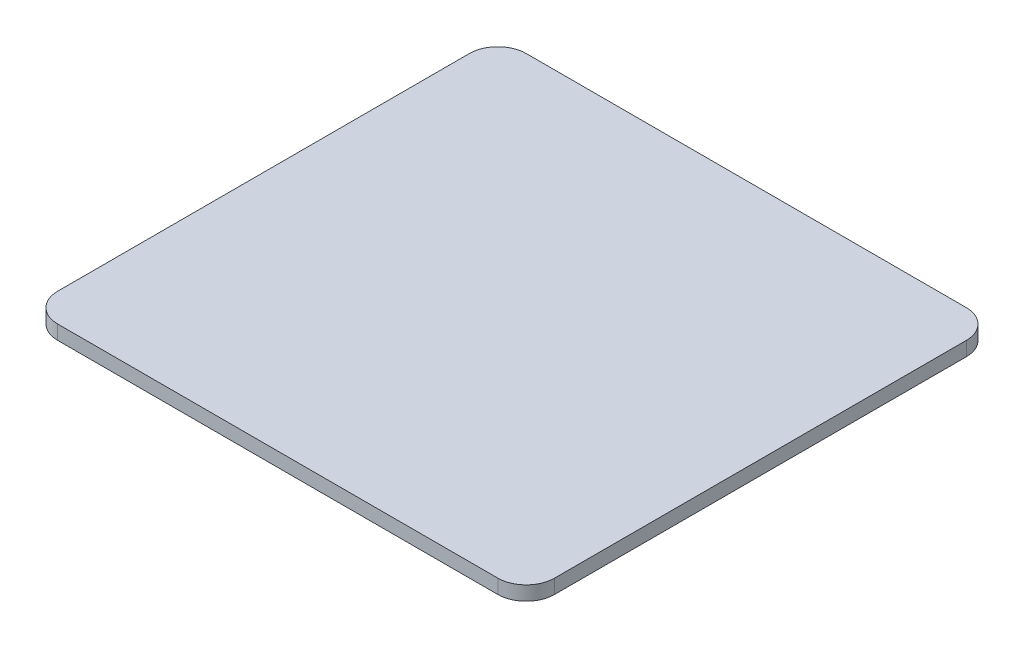
ISO-10303-21;
HEADER;
FILE_DESCRIPTION(('STEP AP214'),'2;1');
FILE_NAME('part.step','',(''),(''),'','','');
FILE_SCHEMA(('AUTOMOTIVE_DESIGN { 1 0 10303 214 1 1 1 1 }'));
ENDSEC;
DATA;
#1=APPLICATION_CONTEXT('core data for automotive mechanical design processes');
#2=APPLICATION_PROTOCOL_DEFINITION('international standard','automotive_design',2000,#1);
#3=PRODUCT_CONTEXT('',#1,'mechanical');
#4=PRODUCT('Part','Part','',(#3));
#5=PRODUCT_RELATED_PRODUCT_CATEGORY('part','',(#4));
#6=PRODUCT_DEFINITION_FORMATION('','',#4);
#7=PRODUCT_DEFINITION_CONTEXT('part definition',#1,'design');
#8=PRODUCT_DEFINITION('design','',#6,#7);
#9=PRODUCT_DEFINITION_SHAPE('','',#8);
#10=(LENGTH_UNIT() NAMED_UNIT(*) SI_UNIT(.MILLI.,.METRE.));
#11=(NAMED_UNIT(*) PLANE_ANGLE_UNIT() SI_UNIT($,.RADIAN.));
#12=(NAMED_UNIT(*) SI_UNIT($,.STERADIAN.) SOLID_ANGLE_UNIT());
#13=UNCERTAINTY_MEASURE_WITH_UNIT(LENGTH_MEASURE(1.E-05),#10,'distance_accuracy_value','');
#14=(GEOMETRIC_REPRESENTATION_CONTEXT(3) GLOBAL_UNCERTAINTY_ASSIGNED_CONTEXT((#13)) GLOBAL_UNIT_ASSIGNED_CONTEXT((#10,
#11,#12)) REPRESENTATION_CONTEXT('',''));
#15=CARTESIAN_POINT('',(0.,0.,0.));
#16=DIRECTION('',(0.,0.,1.));
#17=DIRECTION('',(1.,0.,0.));
#18=AXIS2_PLACEMENT_3D('',#15,#16,#17);
#19=CARTESIAN_POINT('',(129.3870044641,5.,-127.664689841221));
#20=DIRECTION('',(0.,-1.,0.));
#21=DIRECTION('',(0.,0.,-1.));
#22=AXIS2_PLACEMENT_3D('',#19,#20,#21);
#23=CYLINDRICAL_SURFACE('',#22,10.);
#24=CARTESIAN_POINT('',(129.3870044641,0.,-127.664689841221));
#25=DIRECTION('',(0.,1.,0.));
#26=DIRECTION('',(0.,0.,-1.));
#27=AXIS2_PLACEMENT_3D('',#24,#25,#26);
#28=CIRCLE('',#27,10.);
#29=CARTESIAN_POINT('',(139.387004464101,0.,-127.664689841221));
#30=VERTEX_POINT('',#29);
#31=CARTESIAN_POINT('',(129.3870044641,0.,-137.664689841221));
#32=VERTEX_POINT('',#31);
#33=EDGE_CURVE('E129',#30,#32,#28,.T.);
#34=ORIENTED_EDGE('',*,*,#33,.T.);
#35=DIRECTION('',(0.,-1.,0.));
#36=VECTOR('',#35,1.);
#37=CARTESIAN_POINT('',(129.3870044641,5.,-137.664689841221));
#38=LINE('',#37,#36);
#39=CARTESIAN_POINT('',(129.3870044641,5.,-137.664689841221));
#40=VERTEX_POINT('',#39);
#41=EDGE_CURVE('E11',#40,#32,#38,.T.);
#42=ORIENTED_EDGE('',*,*,#41,.F.);
#43=CARTESIAN_POINT('',(129.3870044641,5.,-127.664689841221));
#44=DIRECTION('',(0.,1.,0.));
#45=DIRECTION('',(0.,0.,-1.));
#46=AXIS2_PLACEMENT_3D('',#43,#44,#45);
#47=CIRCLE('',#46,10.);
#48=CARTESIAN_POINT('',(139.387004464101,5.,-127.664689841221));
#49=VERTEX_POINT('',#48);
#50=EDGE_CURVE('E143',#49,#40,#47,.T.);
#51=ORIENTED_EDGE('',*,*,#50,.F.);
#52=DIRECTION('',(0.,-1.,0.));
#53=VECTOR('',#52,1.);
#54=CARTESIAN_POINT('',(139.387004464101,5.,-127.664689841221));
#55=LINE('',#54,#53);
#56=EDGE_CURVE('E125',#49,#30,#55,.T.);
#57=ORIENTED_EDGE('',*,*,#56,.T.);
#58=EDGE_LOOP('',(#34,#42,#51,#57));
#59=FACE_BOUND('',#58,.T.);
#60=ADVANCED_FACE('F33',(#59),#23,.T.);
#61=CARTESIAN_POINT('',(-25.6129955358994,5.,-137.664689841221));
#62=DIRECTION('',(0.,0.,1.));
#63=DIRECTION('',(1.,0.,0.));
#64=AXIS2_PLACEMENT_3D('',#61,#62,#63);
#65=PLANE('',#64);
#66=DIRECTION('',(-1.,0.,0.));
#67=VECTOR('',#66,1.);
#68=CARTESIAN_POINT('',(-25.6129955358994,0.,-137.664689841221));
#69=LINE('',#68,#67);
#70=CARTESIAN_POINT('',(-25.6129955358994,0.,-137.664689841221));
#71=VERTEX_POINT('',#70);
#72=EDGE_CURVE('E132',#32,#71,#69,.T.);
#73=ORIENTED_EDGE('',*,*,#72,.T.);
#74=DIRECTION('',(0.,-1.,0.));
#75=VECTOR('',#74,1.);
#76=CARTESIAN_POINT('',(-25.6129955358994,5.,-137.664689841221));
#77=LINE('',#76,#75);
#78=CARTESIAN_POINT('',(-25.6129955358994,5.,-137.664689841221));
#79=VERTEX_POINT('',#78);
#80=EDGE_CURVE('E41',#79,#71,#77,.T.);
#81=ORIENTED_EDGE('',*,*,#80,.F.);
#82=DIRECTION('',(-1.,0.,0.));
#83=VECTOR('',#82,1.);
#84=CARTESIAN_POINT('',(-25.6129955358994,5.,-137.664689841221));
#85=LINE('',#84,#83);
#86=EDGE_CURVE('E92',#40,#79,#85,.T.);
#87=ORIENTED_EDGE('',*,*,#86,.F.);
#88=ORIENTED_EDGE('',*,*,#41,.T.);
#89=EDGE_LOOP('',(#73,#81,#87,#88));
#90=FACE_BOUND('',#89,.T.);
#91=ADVANCED_FACE('F178',(#90),#65,.F.);
#92=CARTESIAN_POINT('',(-25.6129955358995,5.,-127.664689841221));
#93=DIRECTION('',(0.,-1.,0.));
#94=DIRECTION('',(0.,0.,-1.));
#95=AXIS2_PLACEMENT_3D('',#92,#93,#94);
#96=CYLINDRICAL_SURFACE('',#95,10.);
#97=CARTESIAN_POINT('',(-25.6129955358995,0.,-127.664689841221));
#98=DIRECTION('',(0.,1.,0.));
#99=DIRECTION('',(0.,0.,1.));
#100=AXIS2_PLACEMENT_3D('',#97,#98,#99);
#101=CIRCLE('',#100,10.);
#102=CARTESIAN_POINT('',(-35.6129955358995,0.,-127.664689841221));
#103=VERTEX_POINT('',#102);
#104=EDGE_CURVE('E134',#71,#103,#101,.T.);
#105=ORIENTED_EDGE('',*,*,#104,.T.);
#106=DIRECTION('',(0.,-1.,0.));
#107=VECTOR('',#106,1.);
#108=CARTESIAN_POINT('',(-35.6129955358995,5.,-127.664689841221));
#109=LINE('',#108,#107);
#110=CARTESIAN_POINT('',(-35.6129955358995,5.,-127.664689841221));
#111=VERTEX_POINT('',#110);
#112=EDGE_CURVE('E150',#111,#103,#109,.T.);
#113=ORIENTED_EDGE('',*,*,#112,.F.);
#114=CARTESIAN_POINT('',(-25.6129955358995,5.,-127.664689841221));
#115=DIRECTION('',(0.,1.,0.));
#116=DIRECTION('',(0.,0.,1.));
#117=AXIS2_PLACEMENT_3D('',#114,#115,#116);
#118=CIRCLE('',#117,10.);
#119=EDGE_CURVE('E158',#79,#111,#118,.T.);
#120=ORIENTED_EDGE('',*,*,#119,.F.);
#121=ORIENTED_EDGE('',*,*,#80,.T.);
#122=EDGE_LOOP('',(#105,#113,#120,#121));
#123=FACE_BOUND('',#122,.T.);
#124=ADVANCED_FACE('F156',(#123),#96,.T.);
#125=CARTESIAN_POINT('',(-35.6129955358995,5.,-127.664689841221));
#126=DIRECTION('',(1.,0.,0.));
#127=DIRECTION('',(0.,0.,-1.));
#128=AXIS2_PLACEMENT_3D('',#125,#126,#127);
#129=PLANE('',#128);
#130=DIRECTION('',(0.,0.,1.));
#131=VECTOR('',#130,1.);
#132=CARTESIAN_POINT('',(-35.6129955358995,0.,-127.664689841221));
#133=LINE('',#132,#131);
#134=CARTESIAN_POINT('',(-35.6129955358995,0.,17.3353101587794));
#135=VERTEX_POINT('',#134);
#136=EDGE_CURVE('E136',#103,#135,#133,.T.);
#137=ORIENTED_EDGE('',*,*,#136,.T.);
#138=DIRECTION('',(0.,-1.,0.));
#139=VECTOR('',#138,1.);
#140=CARTESIAN_POINT('',(-35.6129955358995,5.,17.3353101587794));
#141=LINE('',#140,#139);
#142=CARTESIAN_POINT('',(-35.6129955358995,5.,17.3353101587794));
#143=VERTEX_POINT('',#142);
#144=EDGE_CURVE('E147',#143,#135,#141,.T.);
#145=ORIENTED_EDGE('',*,*,#144,.F.);
#146=DIRECTION('',(0.,0.,1.));
#147=VECTOR('',#146,1.);
#148=CARTESIAN_POINT('',(-35.6129955358995,5.,-127.664689841221));
#149=LINE('',#148,#147);
#150=EDGE_CURVE('E170',#111,#143,#149,.T.);
#151=ORIENTED_EDGE('',*,*,#150,.F.);
#152=ORIENTED_EDGE('',*,*,#112,.T.);
#153=EDGE_LOOP('',(#137,#145,#151,#152));
#154=FACE_BOUND('',#153,.T.);
#155=ADVANCED_FACE('F166',(#154),#129,.F.);
#156=CARTESIAN_POINT('',(-25.6129955358995,5.,17.3353101587794));
#157=DIRECTION('',(0.,-1.,0.));
#158=DIRECTION('',(0.,0.,-1.));
#159=AXIS2_PLACEMENT_3D('',#156,#157,#158);
#160=CYLINDRICAL_SURFACE('',#159,10.);
#161=CARTESIAN_POINT('',(-25.6129955358995,0.,17.3353101587794));
#162=DIRECTION('',(0.,1.,0.));
#163=DIRECTION('',(0.,0.,1.));
#164=AXIS2_PLACEMENT_3D('',#161,#162,#163);
#165=CIRCLE('',#164,10.);
#166=CARTESIAN_POINT('',(-25.6129955358995,0.,27.3353101587794));
#167=VERTEX_POINT('',#166);
#168=EDGE_CURVE('E138',#135,#167,#165,.T.);
#169=ORIENTED_EDGE('',*,*,#168,.T.);
#170=DIRECTION('',(0.,-1.,0.));
#171=VECTOR('',#170,1.);
#172=CARTESIAN_POINT('',(-25.6129955358995,5.,27.3353101587794));
#173=LINE('',#172,#171);
#174=CARTESIAN_POINT('',(-25.6129955358995,5.,27.3353101587794));
#175=VERTEX_POINT('',#174);
#176=EDGE_CURVE('E120',#175,#167,#173,.T.);
#177=ORIENTED_EDGE('',*,*,#176,.F.);
#178=CARTESIAN_POINT('',(-25.6129955358995,5.,17.3353101587794));
#179=DIRECTION('',(0.,1.,0.));
#180=DIRECTION('',(0.,0.,1.));
#181=AXIS2_PLACEMENT_3D('',#178,#179,#180);
#182=CIRCLE('',#181,10.);
#183=EDGE_CURVE('E111',#143,#175,#182,.T.);
#184=ORIENTED_EDGE('',*,*,#183,.F.);
#185=ORIENTED_EDGE('',*,*,#144,.T.);
#186=EDGE_LOOP('',(#169,#177,#184,#185));
#187=FACE_BOUND('',#186,.T.);
#188=ADVANCED_FACE('F169',(#187),#160,.T.);
#189=CARTESIAN_POINT('',(-25.6129955358994,5.,27.3353101587794));
#190=DIRECTION('',(0.,0.,-1.));
#191=DIRECTION('',(-1.,0.,0.));
#192=AXIS2_PLACEMENT_3D('',#189,#190,#191);
#193=PLANE('',#192);
#194=DIRECTION('',(1.,0.,0.));
#195=VECTOR('',#194,1.);
#196=CARTESIAN_POINT('',(-25.6129955358994,0.,27.3353101587794));
#197=LINE('',#196,#195);
#198=CARTESIAN_POINT('',(129.3870044641,0.,27.3353101587794));
#199=VERTEX_POINT('',#198);
#200=EDGE_CURVE('E119',#167,#199,#197,.T.);
#201=ORIENTED_EDGE('',*,*,#200,.T.);
#202=DIRECTION('',(0.,-1.,0.));
#203=VECTOR('',#202,1.);
#204=CARTESIAN_POINT('',(129.3870044641,5.,27.3353101587794));
#205=LINE('',#204,#203);
#206=CARTESIAN_POINT('',(129.3870044641,5.,27.3353101587794));
#207=VERTEX_POINT('',#206);
#208=EDGE_CURVE('E116',#207,#199,#205,.T.);
#209=ORIENTED_EDGE('',*,*,#208,.F.);
#210=DIRECTION('',(1.,0.,0.));
#211=VECTOR('',#210,1.);
#212=CARTESIAN_POINT('',(-25.6129955358994,5.,27.3353101587794));
#213=LINE('',#212,#211);
#214=EDGE_CURVE('E105',#175,#207,#213,.T.);
#215=ORIENTED_EDGE('',*,*,#214,.F.);
#216=ORIENTED_EDGE('',*,*,#176,.T.);
#217=EDGE_LOOP('',(#201,#209,#215,#216));
#218=FACE_BOUND('',#217,.T.);
#219=ADVANCED_FACE('F117',(#218),#193,.F.);
#220=CARTESIAN_POINT('',(129.387004464101,5.,17.3353101587794));
#221=DIRECTION('',(0.,-1.,0.));
#222=DIRECTION('',(0.,0.,-1.));
#223=AXIS2_PLACEMENT_3D('',#220,#221,#222);
#224=CYLINDRICAL_SURFACE('',#223,10.);
#225=CARTESIAN_POINT('',(129.387004464101,0.,17.3353101587794));
#226=DIRECTION('',(0.,1.,0.));
#227=DIRECTION('',(0.,0.,1.));
#228=AXIS2_PLACEMENT_3D('',#225,#226,#227);
#229=CIRCLE('',#228,10.);
#230=CARTESIAN_POINT('',(139.387004464101,0.,17.3353101587794));
#231=VERTEX_POINT('',#230);
#232=EDGE_CURVE('E78',#199,#231,#229,.T.);
#233=ORIENTED_EDGE('',*,*,#232,.T.);
#234=DIRECTION('',(0.,-1.,0.));
#235=VECTOR('',#234,1.);
#236=CARTESIAN_POINT('',(139.387004464101,5.,17.3353101587794));
#237=LINE('',#236,#235);
#238=CARTESIAN_POINT('',(139.387004464101,5.,17.3353101587794));
#239=VERTEX_POINT('',#238);
#240=EDGE_CURVE('E121',#239,#231,#237,.T.);
#241=ORIENTED_EDGE('',*,*,#240,.F.);
#242=CARTESIAN_POINT('',(129.387004464101,5.,17.3353101587794));
#243=DIRECTION('',(0.,1.,0.));
#244=DIRECTION('',(0.,0.,1.));
#245=AXIS2_PLACEMENT_3D('',#242,#243,#244);
#246=CIRCLE('',#245,10.);
#247=EDGE_CURVE('E109',#207,#239,#246,.T.);
#248=ORIENTED_EDGE('',*,*,#247,.F.);
#249=ORIENTED_EDGE('',*,*,#208,.T.);
#250=EDGE_LOOP('',(#233,#241,#248,#249));
#251=FACE_BOUND('',#250,.T.);
#252=ADVANCED_FACE('F123',(#251),#224,.T.);
#253=CARTESIAN_POINT('',(139.387004464101,5.,-127.664689841221));
#254=DIRECTION('',(-1.,0.,0.));
#255=DIRECTION('',(0.,0.,1.));
#256=AXIS2_PLACEMENT_3D('',#253,#254,#255);
#257=PLANE('',#256);
#258=DIRECTION('',(0.,0.,-1.));
#259=VECTOR('',#258,1.);
#260=CARTESIAN_POINT('',(139.387004464101,0.,-127.664689841221));
#261=LINE('',#260,#259);
#262=EDGE_CURVE('E84',#231,#30,#261,.T.);
#263=ORIENTED_EDGE('',*,*,#262,.T.);
#264=ORIENTED_EDGE('',*,*,#56,.F.);
#265=DIRECTION('',(0.,0.,-1.));
#266=VECTOR('',#265,1.);
#267=CARTESIAN_POINT('',(139.387004464101,5.,-127.664689841221));
#268=LINE('',#267,#266);
#269=EDGE_CURVE('E49',#239,#49,#268,.T.);
#270=ORIENTED_EDGE('',*,*,#269,.F.);
#271=ORIENTED_EDGE('',*,*,#240,.T.);
#272=EDGE_LOOP('',(#263,#264,#270,#271));
#273=FACE_BOUND('',#272,.T.);
#274=ADVANCED_FACE('F194',(#273),#257,.F.);
#275=CARTESIAN_POINT('',(129.3870044641,5.,-127.664689841221));
#276=DIRECTION('',(0.,-1.,0.));
#277=DIRECTION('',(0.,0.,-1.));
#278=AXIS2_PLACEMENT_3D('',#275,#276,#277);
#279=PLANE('',#278);
#280=ORIENTED_EDGE('',*,*,#50,.T.);
#281=ORIENTED_EDGE('',*,*,#86,.T.);
#282=ORIENTED_EDGE('',*,*,#119,.T.);
#283=ORIENTED_EDGE('',*,*,#150,.T.);
#284=ORIENTED_EDGE('',*,*,#183,.T.);
#285=ORIENTED_EDGE('',*,*,#214,.T.);
#286=ORIENTED_EDGE('',*,*,#247,.T.);
#287=ORIENTED_EDGE('',*,*,#269,.T.);
#288=EDGE_LOOP('',(#280,#281,#282,#283,#284,#285,#286,#287));
#289=FACE_BOUND('',#288,.T.);
#290=ADVANCED_FACE('F107',(#289),#279,.F.);
#291=CARTESIAN_POINT('',(129.3870044641,0.,-127.664689841221));
#292=DIRECTION('',(0.,-1.,0.));
#293=DIRECTION('',(0.,0.,-1.));
#294=AXIS2_PLACEMENT_3D('',#291,#292,#293);
#295=PLANE('',#294);
#296=ORIENTED_EDGE('',*,*,#33,.F.);
#297=ORIENTED_EDGE('',*,*,#262,.F.);
#298=ORIENTED_EDGE('',*,*,#232,.F.);
#299=ORIENTED_EDGE('',*,*,#200,.F.);
#300=ORIENTED_EDGE('',*,*,#168,.F.);
#301=ORIENTED_EDGE('',*,*,#136,.F.);
#302=ORIENTED_EDGE('',*,*,#104,.F.);
#303=ORIENTED_EDGE('',*,*,#72,.F.);
#304=EDGE_LOOP('',(#296,#297,#298,#299,#300,#301,#302,#303));
#305=FACE_BOUND('',#304,.T.);
#306=ADVANCED_FACE('F162',(#305),#295,.T.);
#307=CLOSED_SHELL('',(#60,#91,#124,#155,#188,#219,#252,#274,#290,#306));
#308=MANIFOLD_SOLID_BREP('B2',#307);
#309=ADVANCED_BREP_SHAPE_REPRESENTATION('',(#18,#308),#14);
#310=SHAPE_DEFINITION_REPRESENTATION(#9,#309);
ENDSEC;
END-ISO-10303-21;
